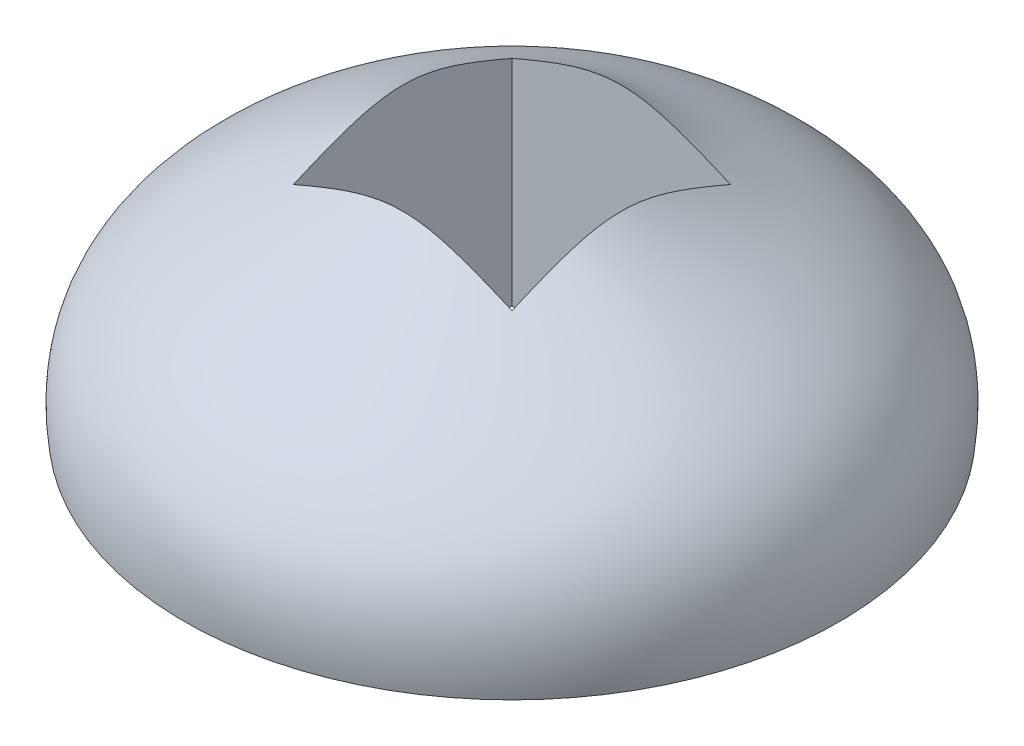
ISO-10303-21;
HEADER;
FILE_DESCRIPTION(('STEP AP214'),'2;1');
FILE_NAME('part.step','',(''),(''),'','','');
FILE_SCHEMA(('AUTOMOTIVE_DESIGN { 1 0 10303 214 1 1 1 1 }'));
ENDSEC;
DATA;
#1=APPLICATION_CONTEXT('core data for automotive mechanical design processes');
#2=APPLICATION_PROTOCOL_DEFINITION('international standard','automotive_design',2000,#1);
#3=PRODUCT_CONTEXT('',#1,'mechanical');
#4=PRODUCT('Part','Part','',(#3));
#5=PRODUCT_RELATED_PRODUCT_CATEGORY('part','',(#4));
#6=PRODUCT_DEFINITION_FORMATION('','',#4);
#7=PRODUCT_DEFINITION_CONTEXT('part definition',#1,'design');
#8=PRODUCT_DEFINITION('design','',#6,#7);
#9=PRODUCT_DEFINITION_SHAPE('','',#8);
#10=(LENGTH_UNIT() NAMED_UNIT(*) SI_UNIT(.MILLI.,.METRE.));
#11=(NAMED_UNIT(*) PLANE_ANGLE_UNIT() SI_UNIT($,.RADIAN.));
#12=(NAMED_UNIT(*) SI_UNIT($,.STERADIAN.) SOLID_ANGLE_UNIT());
#13=UNCERTAINTY_MEASURE_WITH_UNIT(LENGTH_MEASURE(1.E-05),#10,'distance_accuracy_value','');
#14=(GEOMETRIC_REPRESENTATION_CONTEXT(3) GLOBAL_UNCERTAINTY_ASSIGNED_CONTEXT((#13)) GLOBAL_UNIT_ASSIGNED_CONTEXT((#10,
#11,#12)) REPRESENTATION_CONTEXT('',''));
#15=CARTESIAN_POINT('',(0.,0.,0.));
#16=DIRECTION('',(0.,0.,1.));
#17=DIRECTION('',(1.,0.,0.));
#18=AXIS2_PLACEMENT_3D('',#15,#16,#17);
#19=CARTESIAN_POINT('',(0.,0.,0.));
#20=DIRECTION('',(0.,-1.,0.));
#21=DIRECTION('',(0.,0.,-1.));
#22=AXIS2_PLACEMENT_3D('',#19,#20,#21);
#23=PLANE('',#22);
#24=DIRECTION('',(0.,0.,1.));
#25=VECTOR('',#24,1.);
#26=CARTESIAN_POINT('',(0.2,0.,-0.2));
#27=LINE('',#26,#25);
#28=CARTESIAN_POINT('',(0.2,0.,-0.2));
#29=VERTEX_POINT('',#28);
#30=CARTESIAN_POINT('',(0.2,0.,0.2));
#31=VERTEX_POINT('',#30);
#32=EDGE_CURVE('E52',#29,#31,#27,.T.);
#33=ORIENTED_EDGE('',*,*,#32,.F.);
#34=DIRECTION('',(1.,0.,0.));
#35=VECTOR('',#34,1.);
#36=CARTESIAN_POINT('',(-0.2,0.,-0.2));
#37=LINE('',#36,#35);
#38=CARTESIAN_POINT('',(-0.2,0.,-0.2));
#39=VERTEX_POINT('',#38);
#40=EDGE_CURVE('E95',#39,#29,#37,.T.);
#41=ORIENTED_EDGE('',*,*,#40,.F.);
#42=DIRECTION('',(0.,0.,-1.));
#43=VECTOR('',#42,1.);
#44=CARTESIAN_POINT('',(-0.2,0.,-0.2));
#45=LINE('',#44,#43);
#46=CARTESIAN_POINT('',(-0.2,0.,0.2));
#47=VERTEX_POINT('',#46);
#48=EDGE_CURVE('E80',#47,#39,#45,.T.);
#49=ORIENTED_EDGE('',*,*,#48,.F.);
#50=DIRECTION('',(-1.,0.,0.));
#51=VECTOR('',#50,1.);
#52=CARTESIAN_POINT('',(-0.2,0.,0.2));
#53=LINE('',#52,#51);
#54=EDGE_CURVE('E89',#31,#47,#53,.T.);
#55=ORIENTED_EDGE('',*,*,#54,.F.);
#56=EDGE_LOOP('',(#33,#41,#49,#55));
#57=FACE_BOUND('',#56,.T.);
#58=CARTESIAN_POINT('',(0.,0.,0.));
#59=DIRECTION('',(0.,-1.,0.));
#60=DIRECTION('',(0.,0.,-1.));
#61=AXIS2_PLACEMENT_3D('',#58,#59,#60);
#62=CIRCLE('',#61,0.6);
#63=CARTESIAN_POINT('',(0.,0.,-0.6));
#64=VERTEX_POINT('',#63);
#65=EDGE_CURVE('E102',#64,#64,#62,.T.);
#66=ORIENTED_EDGE('',*,*,#65,.T.);
#67=EDGE_LOOP('',(#66));
#68=FACE_BOUND('',#67,.T.);
#69=ADVANCED_FACE('F33',(#57,#68),#23,.T.);
#70=CARTESIAN_POINT('',(0.6,0.,0.));
#71=CARTESIAN_POINT('',(0.641051819996733,0.302201542156068,0.));
#72=CARTESIAN_POINT('',(0.294253127996891,0.32466999156842,0.));
#73=CARTESIAN_POINT('',(0.15,0.5,0.));
#74=B_SPLINE_CURVE_WITH_KNOTS('',3,(#70,#71,#72,#73),.UNSPECIFIED.,.F.,.F.,(4,4),(0.,1.),.UNSPECIFIED.);
#75=CARTESIAN_POINT('',(0.,0.,0.));
#76=DIRECTION('',(0.,-1.,0.));
#77=AXIS1_PLACEMENT('',#75,#76);
#78=SURFACE_OF_REVOLUTION('',#74,#77);
#79=CARTESIAN_POINT('',(0.2,0.392889667395908,0.2));
#80=CARTESIAN_POINT('',(0.2,0.397626201314701,0.188951413835387));
#81=CARTESIAN_POINT('',(0.2,0.402327383256414,0.177885116854765));
#82=CARTESIAN_POINT('',(0.2,0.411518214020456,0.155620924782071));
#83=CARTESIAN_POINT('',(0.2,0.416007076777544,0.144422707320643));
#84=CARTESIAN_POINT('',(0.2,0.424606017642498,0.121851798446511));
#85=CARTESIAN_POINT('',(0.2,0.428715333823758,0.110478807338444));
#86=CARTESIAN_POINT('',(0.2,0.43622636545588,0.0875146454357258));
#87=CARTESIAN_POINT('',(0.2,0.439628941956757,0.0759237591208809));
#88=CARTESIAN_POINT('',(0.2,0.44621715042275,0.0483554901760638));
#89=CARTESIAN_POINT('',(0.2,0.448921807868027,0.0322459738117186));
#90=CARTESIAN_POINT('',(0.2,0.450532271607376,0.00793471426890487));
#91=CARTESIAN_POINT('',(0.2,0.450662127453317,-0.000187608319448706));
#92=CARTESIAN_POINT('',(0.2,0.45010522282215,-0.0164013095280964));
#93=CARTESIAN_POINT('',(0.2,0.4494186711464,-0.02449269552974));
#94=CARTESIAN_POINT('',(0.2,0.447105048909684,-0.042166192704818));
#95=CARTESIAN_POINT('',(0.2,0.445318904222008,-0.0517268487581755));
#96=CARTESIAN_POINT('',(0.2,0.440951156575042,-0.0706819362467757));
#97=CARTESIAN_POINT('',(0.2,0.438367519550667,-0.0800758769171883));
#98=CARTESIAN_POINT('',(0.2,0.432654104744141,-0.0987288838906953));
#99=CARTESIAN_POINT('',(0.200000000000001,0.429522387531808,-0.107987340285656));
#100=CARTESIAN_POINT('',(0.199999999999999,0.422843401105243,-0.126581040370459));
#101=CARTESIAN_POINT('',(0.199999999999998,0.419288508509879,-0.135913495870978));
#102=CARTESIAN_POINT('',(0.200000000000002,0.411978910085021,-0.154452323786969));
#103=CARTESIAN_POINT('',(0.200000000000007,0.408225130705793,-0.163659066105171));
#104=CARTESIAN_POINT('',(0.199999999999993,0.400620345628115,-0.181915049086706));
#105=CARTESIAN_POINT('',(0.199999999999972,0.396770842555103,-0.190964913417239));
#106=CARTESIAN_POINT('',(0.199999999999924,0.39288966739595,-0.19999999999998));
#107=B_SPLINE_CURVE_WITH_KNOTS('',3,(#79,#80,#81,#82,#83,#84,#85,#86,#87,#88,#89,#90,#91,#92,
#93,#94,#95,#96,#97,#98,#99,#100,#101,#102,#103,#104,#105,#106),.UNSPECIFIED.,.F.,.F.,(4,2,2,2,
2,2,2,2,2,2,2,2,2,4),(0.,0.036066514702991,0.0722575062100786,0.10851963878371,
0.144737329155938,0.193466169220277,0.217795418667022,0.242118447093291,0.271248960946149,
0.300454397075977,0.329765349668377,0.359720825430923,0.389547294590759,0.41904917646508),.UNSPECIFIED.);
#108=CARTESIAN_POINT('',(0.2,0.39288966739595,0.2));
#109=VERTEX_POINT('',#108);
#110=CARTESIAN_POINT('',(0.2,0.392889667395908,-0.2));
#111=VERTEX_POINT('',#110);
#112=EDGE_CURVE('E11',#109,#111,#107,.T.);
#113=ORIENTED_EDGE('',*,*,#112,.F.);
#114=CARTESIAN_POINT('',(-0.2,0.392889667395908,0.2));
#115=CARTESIAN_POINT('',(-0.188951413835387,0.397626201314701,0.2));
#116=CARTESIAN_POINT('',(-0.177885116854765,0.402327383256414,0.2));
#117=CARTESIAN_POINT('',(-0.155620924782071,0.411518214020456,0.2));
#118=CARTESIAN_POINT('',(-0.144422707320643,0.416007076777544,0.2));
#119=CARTESIAN_POINT('',(-0.121851798446511,0.424606017642497,0.2));
#120=CARTESIAN_POINT('',(-0.110478807338444,0.428715333823758,0.2));
#121=CARTESIAN_POINT('',(-0.0875146454357258,0.43622636545588,0.2));
#122=CARTESIAN_POINT('',(-0.0759237591208809,0.439628941956757,0.2));
#123=CARTESIAN_POINT('',(-0.0483554901760637,0.446217150422749,0.2));
#124=CARTESIAN_POINT('',(-0.0322459738117185,0.448921807868027,0.2));
#125=CARTESIAN_POINT('',(-0.00793471426890478,0.450532271607376,0.2));
#126=CARTESIAN_POINT('',(0.000187608319448789,0.450662127453317,0.2));
#127=CARTESIAN_POINT('',(0.0164013095280964,0.45010522282215,0.2));
#128=CARTESIAN_POINT('',(0.02449269552974,0.4494186711464,0.2));
#129=CARTESIAN_POINT('',(0.0421661927048181,0.447105048909684,0.2));
#130=CARTESIAN_POINT('',(0.0517268487581755,0.445318904222008,0.2));
#131=CARTESIAN_POINT('',(0.0706819362467757,0.440951156575042,0.2));
#132=CARTESIAN_POINT('',(0.0800758769171883,0.438367519550667,0.2));
#133=CARTESIAN_POINT('',(0.0987288838906952,0.43265410474414,0.2));
#134=CARTESIAN_POINT('',(0.107987340285656,0.429522387531808,0.200000000000001));
#135=CARTESIAN_POINT('',(0.126581040370459,0.422843401105243,0.199999999999999));
#136=CARTESIAN_POINT('',(0.135913495870978,0.419288508509879,0.199999999999998));
#137=CARTESIAN_POINT('',(0.154452323786969,0.411978910085021,0.200000000000002));
#138=CARTESIAN_POINT('',(0.163659066105171,0.408225130705793,0.200000000000008));
#139=CARTESIAN_POINT('',(0.181915049086706,0.400620345628115,0.199999999999993));
#140=CARTESIAN_POINT('',(0.190964913417239,0.396770842555103,0.199999999999972));
#141=CARTESIAN_POINT('',(0.19999999999998,0.39288966739595,0.199999999999924));
#142=B_SPLINE_CURVE_WITH_KNOTS('',3,(#114,#115,#116,#117,#118,#119,#120,#121,#122,#123,#124,
#125,#126,#127,#128,#129,#130,#131,#132,#133,#134,#135,#136,#137,#138,#139,#140,#141),
.UNSPECIFIED.,.F.,.F.,(4,2,2,2,2,2,2,2,2,2,2,2,2,4),(0.,0.036066514702991,0.0722575062100785,
0.10851963878371,0.144737329155938,0.193466169220277,0.217795418667022,0.242118447093291,
0.271248960946149,0.300454397075977,0.329765349668377,0.359720825430923,0.389547294590759,
0.41904917646508),.UNSPECIFIED.);
#143=CARTESIAN_POINT('',(-0.2,0.392889667395908,0.2));
#144=VERTEX_POINT('',#143);
#145=EDGE_CURVE('E122',#144,#109,#142,.T.);
#146=ORIENTED_EDGE('',*,*,#145,.F.);
#147=CARTESIAN_POINT('',(-0.2,0.392889667395908,-0.2));
#148=CARTESIAN_POINT('',(-0.2,0.397626201314701,-0.188951413835387));
#149=CARTESIAN_POINT('',(-0.2,0.402327383256414,-0.177885116854765));
#150=CARTESIAN_POINT('',(-0.2,0.411518214020456,-0.155620924782071));
#151=CARTESIAN_POINT('',(-0.2,0.416007076777544,-0.144422707320643));
#152=CARTESIAN_POINT('',(-0.2,0.424606017642498,-0.121851798446511));
#153=CARTESIAN_POINT('',(-0.2,0.428715333823758,-0.110478807338444));
#154=CARTESIAN_POINT('',(-0.2,0.43622636545588,-0.0875146454357257));
#155=CARTESIAN_POINT('',(-0.2,0.439628941956757,-0.0759237591208809));
#156=CARTESIAN_POINT('',(-0.2,0.44621715042275,-0.0483554901760637));
#157=CARTESIAN_POINT('',(-0.2,0.448921807868027,-0.0322459738117185));
#158=CARTESIAN_POINT('',(-0.2,0.450532271607376,-0.00793471426890475));
#159=CARTESIAN_POINT('',(-0.2,0.450662127453317,0.00018760831944881));
#160=CARTESIAN_POINT('',(-0.2,0.45010522282215,0.0164013095280965));
#161=CARTESIAN_POINT('',(-0.2,0.4494186711464,0.0244926955297401));
#162=CARTESIAN_POINT('',(-0.2,0.447105048909684,0.0421661927048181));
#163=CARTESIAN_POINT('',(-0.2,0.445318904222008,0.0517268487581755));
#164=CARTESIAN_POINT('',(-0.2,0.440951156575042,0.0706819362467757));
#165=CARTESIAN_POINT('',(-0.2,0.438367519550667,0.0800758769171883));
#166=CARTESIAN_POINT('',(-0.2,0.432654104744141,0.0987288838906952));
#167=CARTESIAN_POINT('',(-0.200000000000001,0.429522387531808,0.107987340285656));
#168=CARTESIAN_POINT('',(-0.199999999999999,0.422843401105243,0.126581040370459));
#169=CARTESIAN_POINT('',(-0.199999999999998,0.419288508509879,0.135913495870978));
#170=CARTESIAN_POINT('',(-0.200000000000002,0.411978910085021,0.154452323786969));
#171=CARTESIAN_POINT('',(-0.200000000000008,0.408225130705793,0.163659066105171));
#172=CARTESIAN_POINT('',(-0.199999999999993,0.400620345628115,0.181915049086706));
#173=CARTESIAN_POINT('',(-0.199999999999973,0.396770842555103,0.190964913417239));
#174=CARTESIAN_POINT('',(-0.199999999999924,0.39288966739595,0.19999999999998));
#175=B_SPLINE_CURVE_WITH_KNOTS('',3,(#147,#148,#149,#150,#151,#152,#153,#154,#155,#156,#157,
#158,#159,#160,#161,#162,#163,#164,#165,#166,#167,#168,#169,#170,#171,#172,#173,#174),
.UNSPECIFIED.,.F.,.F.,(4,2,2,2,2,2,2,2,2,2,2,2,2,4),(0.,0.036066514702991,0.0722575062100786,
0.10851963878371,0.144737329155938,0.193466169220277,0.217795418667022,0.242118447093291,
0.271248960946149,0.300454397075977,0.329765349668377,0.359720825430923,0.389547294590759,
0.41904917646508),.UNSPECIFIED.);
#176=CARTESIAN_POINT('',(-0.2,0.392889667395908,-0.2));
#177=VERTEX_POINT('',#176);
#178=EDGE_CURVE('E83',#177,#144,#175,.T.);
#179=ORIENTED_EDGE('',*,*,#178,.F.);
#180=CARTESIAN_POINT('',(0.2,0.392889667395908,-0.2));
#181=CARTESIAN_POINT('',(0.188951413835387,0.397626201314701,-0.2));
#182=CARTESIAN_POINT('',(0.177885116854765,0.402327383256415,-0.2));
#183=CARTESIAN_POINT('',(0.155620924782071,0.411518214020456,-0.2));
#184=CARTESIAN_POINT('',(0.144422707320643,0.416007076777544,-0.2));
#185=CARTESIAN_POINT('',(0.121851798446511,0.424606017642498,-0.2));
#186=CARTESIAN_POINT('',(0.110478807338444,0.428715333823758,-0.2));
#187=CARTESIAN_POINT('',(0.0875146454357258,0.43622636545588,-0.2));
#188=CARTESIAN_POINT('',(0.0759237591208809,0.439628941956757,-0.2));
#189=CARTESIAN_POINT('',(0.0483554901760638,0.44621715042275,-0.2));
#190=CARTESIAN_POINT('',(0.0322459738117186,0.448921807868027,-0.2));
#191=CARTESIAN_POINT('',(0.00793471426890483,0.450532271607376,-0.2));
#192=CARTESIAN_POINT('',(-0.000187608319448728,0.450662127453317,-0.2));
#193=CARTESIAN_POINT('',(-0.0164013095280964,0.45010522282215,-0.2));
#194=CARTESIAN_POINT('',(-0.02449269552974,0.4494186711464,-0.2));
#195=CARTESIAN_POINT('',(-0.042166192704818,0.447105048909684,-0.2));
#196=CARTESIAN_POINT('',(-0.0517268487581754,0.445318904222008,-0.2));
#197=CARTESIAN_POINT('',(-0.0706819362467756,0.440951156575042,-0.2));
#198=CARTESIAN_POINT('',(-0.0800758769171882,0.438367519550667,-0.2));
#199=CARTESIAN_POINT('',(-0.0987288838906951,0.432654104744141,-0.2));
#200=CARTESIAN_POINT('',(-0.107987340285656,0.429522387531808,-0.200000000000001));
#201=CARTESIAN_POINT('',(-0.126581040370459,0.422843401105243,-0.199999999999999));
#202=CARTESIAN_POINT('',(-0.135913495870978,0.419288508509879,-0.199999999999998));
#203=CARTESIAN_POINT('',(-0.154452323786969,0.411978910085021,-0.200000000000002));
#204=CARTESIAN_POINT('',(-0.163659066105171,0.408225130705793,-0.200000000000007));
#205=CARTESIAN_POINT('',(-0.181915049086706,0.400620345628115,-0.199999999999993));
#206=CARTESIAN_POINT('',(-0.190964913417239,0.396770842555103,-0.199999999999972));
#207=CARTESIAN_POINT('',(-0.19999999999998,0.39288966739595,-0.199999999999924));
#208=B_SPLINE_CURVE_WITH_KNOTS('',3,(#180,#181,#182,#183,#184,#185,#186,#187,#188,#189,#190,
#191,#192,#193,#194,#195,#196,#197,#198,#199,#200,#201,#202,#203,#204,#205,#206,#207),
.UNSPECIFIED.,.F.,.F.,(4,2,2,2,2,2,2,2,2,2,2,2,2,4),(0.,0.036066514702991,0.0722575062100785,
0.10851963878371,0.144737329155938,0.193466169220276,0.217795418667022,0.242118447093291,
0.271248960946148,0.300454397075977,0.329765349668377,0.359720825430922,0.389547294590759,
0.419049176465079),.UNSPECIFIED.);
#209=EDGE_CURVE('E45',#111,#177,#208,.T.);
#210=ORIENTED_EDGE('',*,*,#209,.F.);
#211=EDGE_LOOP('',(#113,#146,#179,#210));
#212=FACE_BOUND('',#211,.T.);
#213=ORIENTED_EDGE('',*,*,#65,.F.);
#214=EDGE_LOOP('',(#213));
#215=FACE_BOUND('',#214,.T.);
#216=ADVANCED_FACE('F113',(#212,#215),#78,.F.);
#217=CARTESIAN_POINT('',(0.2,0.5,-0.2));
#218=DIRECTION('',(1.,0.,0.));
#219=DIRECTION('',(0.,0.,-1.));
#220=AXIS2_PLACEMENT_3D('',#217,#218,#219);
#221=PLANE('',#220);
#222=ORIENTED_EDGE('',*,*,#112,.T.);
#223=DIRECTION('',(0.,-1.,0.));
#224=VECTOR('',#223,1.);
#225=CARTESIAN_POINT('',(0.2,0.5,-0.2));
#226=LINE('',#225,#224);
#227=EDGE_CURVE('E100',#111,#29,#226,.T.);
#228=ORIENTED_EDGE('',*,*,#227,.T.);
#229=ORIENTED_EDGE('',*,*,#32,.T.);
#230=DIRECTION('',(0.,-1.,0.));
#231=VECTOR('',#230,1.);
#232=CARTESIAN_POINT('',(0.2,0.5,0.2));
#233=LINE('',#232,#231);
#234=EDGE_CURVE('E86',#109,#31,#233,.T.);
#235=ORIENTED_EDGE('',*,*,#234,.F.);
#236=EDGE_LOOP('',(#222,#228,#229,#235));
#237=FACE_BOUND('',#236,.T.);
#238=ADVANCED_FACE('F116',(#237),#221,.F.);
#239=CARTESIAN_POINT('',(-0.2,0.5,-0.2));
#240=DIRECTION('',(0.,0.,-1.));
#241=DIRECTION('',(-1.,0.,0.));
#242=AXIS2_PLACEMENT_3D('',#239,#240,#241);
#243=PLANE('',#242);
#244=ORIENTED_EDGE('',*,*,#209,.T.);
#245=DIRECTION('',(0.,-1.,0.));
#246=VECTOR('',#245,1.);
#247=CARTESIAN_POINT('',(-0.2,0.5,-0.2));
#248=LINE('',#247,#246);
#249=EDGE_CURVE('E85',#177,#39,#248,.T.);
#250=ORIENTED_EDGE('',*,*,#249,.T.);
#251=ORIENTED_EDGE('',*,*,#40,.T.);
#252=ORIENTED_EDGE('',*,*,#227,.F.);
#253=EDGE_LOOP('',(#244,#250,#251,#252));
#254=FACE_BOUND('',#253,.T.);
#255=ADVANCED_FACE('F139',(#254),#243,.F.);
#256=CARTESIAN_POINT('',(-0.2,0.5,-0.2));
#257=DIRECTION('',(-1.,0.,0.));
#258=DIRECTION('',(0.,0.,1.));
#259=AXIS2_PLACEMENT_3D('',#256,#257,#258);
#260=PLANE('',#259);
#261=ORIENTED_EDGE('',*,*,#178,.T.);
#262=DIRECTION('',(0.,-1.,0.));
#263=VECTOR('',#262,1.);
#264=CARTESIAN_POINT('',(-0.2,0.5,0.2));
#265=LINE('',#264,#263);
#266=EDGE_CURVE('E60',#144,#47,#265,.T.);
#267=ORIENTED_EDGE('',*,*,#266,.T.);
#268=ORIENTED_EDGE('',*,*,#48,.T.);
#269=ORIENTED_EDGE('',*,*,#249,.F.);
#270=EDGE_LOOP('',(#261,#267,#268,#269));
#271=FACE_BOUND('',#270,.T.);
#272=ADVANCED_FACE('F77',(#271),#260,.F.);
#273=CARTESIAN_POINT('',(-0.2,0.5,0.2));
#274=DIRECTION('',(0.,0.,1.));
#275=DIRECTION('',(1.,0.,0.));
#276=AXIS2_PLACEMENT_3D('',#273,#274,#275);
#277=PLANE('',#276);
#278=ORIENTED_EDGE('',*,*,#145,.T.);
#279=ORIENTED_EDGE('',*,*,#234,.T.);
#280=ORIENTED_EDGE('',*,*,#54,.T.);
#281=ORIENTED_EDGE('',*,*,#266,.F.);
#282=EDGE_LOOP('',(#278,#279,#280,#281));
#283=FACE_BOUND('',#282,.T.);
#284=ADVANCED_FACE('F90',(#283),#277,.F.);
#285=CLOSED_SHELL('',(#69,#216,#238,#255,#272,#284));
#286=MANIFOLD_SOLID_BREP('B2',#285);
#287=ADVANCED_BREP_SHAPE_REPRESENTATION('',(#18,#286),#14);
#288=SHAPE_DEFINITION_REPRESENTATION(#9,#287);
ENDSEC;
END-ISO-10303-21;
